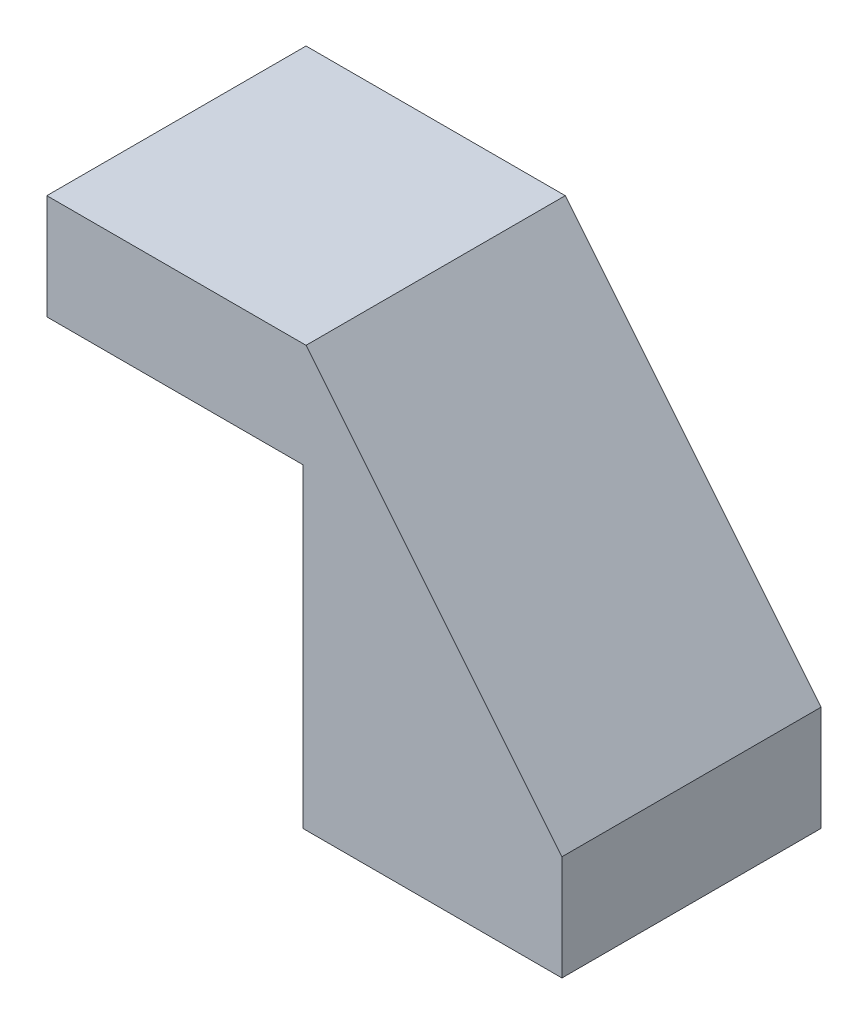
ISO-10303-21;
HEADER;
FILE_DESCRIPTION(('STEP AP214'),'2;1');
FILE_NAME('part.step','',(''),(''),'','','');
FILE_SCHEMA(('AUTOMOTIVE_DESIGN { 1 0 10303 214 1 1 1 1 }'));
ENDSEC;
DATA;
#1=APPLICATION_CONTEXT('core data for automotive mechanical design processes');
#2=APPLICATION_PROTOCOL_DEFINITION('international standard','automotive_design',2000,#1);
#3=PRODUCT_CONTEXT('',#1,'mechanical');
#4=PRODUCT('Part','Part','',(#3));
#5=PRODUCT_RELATED_PRODUCT_CATEGORY('part','',(#4));
#6=PRODUCT_DEFINITION_FORMATION('','',#4);
#7=PRODUCT_DEFINITION_CONTEXT('part definition',#1,'design');
#8=PRODUCT_DEFINITION('design','',#6,#7);
#9=PRODUCT_DEFINITION_SHAPE('','',#8);
#10=(LENGTH_UNIT() NAMED_UNIT(*) SI_UNIT(.MILLI.,.METRE.));
#11=(NAMED_UNIT(*) PLANE_ANGLE_UNIT() SI_UNIT($,.RADIAN.));
#12=(NAMED_UNIT(*) SI_UNIT($,.STERADIAN.) SOLID_ANGLE_UNIT());
#13=UNCERTAINTY_MEASURE_WITH_UNIT(LENGTH_MEASURE(1.E-05),#10,'distance_accuracy_value','');
#14=(GEOMETRIC_REPRESENTATION_CONTEXT(3) GLOBAL_UNCERTAINTY_ASSIGNED_CONTEXT((#13)) GLOBAL_UNIT_ASSIGNED_CONTEXT((#10,
#11,#12)) REPRESENTATION_CONTEXT('',''));
#15=CARTESIAN_POINT('',(0.,0.,0.));
#16=DIRECTION('',(0.,0.,1.));
#17=DIRECTION('',(1.,0.,0.));
#18=AXIS2_PLACEMENT_3D('',#15,#16,#17);
#19=CARTESIAN_POINT('',(0.,3.2,0.));
#20=DIRECTION('',(1.,0.,0.));
#21=DIRECTION('',(0.,0.,-1.));
#22=AXIS2_PLACEMENT_3D('',#19,#20,#21);
#23=PLANE('',#22);
#24=DIRECTION('',(0.,0.,1.));
#25=VECTOR('',#24,1.);
#26=CARTESIAN_POINT('',(0.,0.,0.));
#27=LINE('',#26,#25);
#28=CARTESIAN_POINT('',(0.,0.,-7.9));
#29=VERTEX_POINT('',#28);
#30=CARTESIAN_POINT('',(0.,0.,0.));
#31=VERTEX_POINT('',#30);
#32=EDGE_CURVE('E118',#29,#31,#27,.T.);
#33=ORIENTED_EDGE('',*,*,#32,.T.);
#34=DIRECTION('',(0.,-1.,0.));
#35=VECTOR('',#34,1.);
#36=CARTESIAN_POINT('',(0.,3.2,0.));
#37=LINE('',#36,#35);
#38=CARTESIAN_POINT('',(0.,9.6,0.));
#39=VERTEX_POINT('',#38);
#40=EDGE_CURVE('E11',#39,#31,#37,.T.);
#41=ORIENTED_EDGE('',*,*,#40,.F.);
#42=DIRECTION('',(0.,0.,-1.));
#43=VECTOR('',#42,1.);
#44=CARTESIAN_POINT('',(0.,9.6,-7.9));
#45=LINE('',#44,#43);
#46=CARTESIAN_POINT('',(0.,9.6,-7.9));
#47=VERTEX_POINT('',#46);
#48=EDGE_CURVE('E116',#39,#47,#45,.T.);
#49=ORIENTED_EDGE('',*,*,#48,.T.);
#50=DIRECTION('',(0.,-1.,0.));
#51=VECTOR('',#50,1.);
#52=CARTESIAN_POINT('',(0.,3.2,-7.9));
#53=LINE('',#52,#51);
#54=EDGE_CURVE('E110',#47,#29,#53,.T.);
#55=ORIENTED_EDGE('',*,*,#54,.T.);
#56=EDGE_LOOP('',(#33,#41,#49,#55));
#57=FACE_BOUND('',#56,.T.);
#58=ADVANCED_FACE('F33',(#57),#23,.F.);
#59=CARTESIAN_POINT('',(0.,3.2,0.));
#60=DIRECTION('',(0.,0.,-1.));
#61=DIRECTION('',(-1.,0.,0.));
#62=AXIS2_PLACEMENT_3D('',#59,#60,#61);
#63=PLANE('',#62);
#64=DIRECTION('',(0.,-1.,0.));
#65=VECTOR('',#64,1.);
#66=CARTESIAN_POINT('',(7.9,3.2,0.));
#67=LINE('',#66,#65);
#68=CARTESIAN_POINT('',(7.9,3.2,0.));
#69=VERTEX_POINT('',#68);
#70=CARTESIAN_POINT('',(7.9,0.,0.));
#71=VERTEX_POINT('',#70);
#72=EDGE_CURVE('E40',#69,#71,#67,.T.);
#73=ORIENTED_EDGE('',*,*,#72,.F.);
#74=DIRECTION('',(-0.630592625094466,0.776114000116266,0.));
#75=VECTOR('',#74,1.);
#76=CARTESIAN_POINT('',(0.1,12.8,0.));
#77=LINE('',#76,#75);
#78=CARTESIAN_POINT('',(0.1,12.8,0.));
#79=VERTEX_POINT('',#78);
#80=EDGE_CURVE('E94',#69,#79,#77,.T.);
#81=ORIENTED_EDGE('',*,*,#80,.T.);
#82=DIRECTION('',(1.,0.,0.));
#83=VECTOR('',#82,1.);
#84=CARTESIAN_POINT('',(0.1,12.8,0.));
#85=LINE('',#84,#83);
#86=CARTESIAN_POINT('',(-7.8,12.8,0.));
#87=VERTEX_POINT('',#86);
#88=EDGE_CURVE('E154',#87,#79,#85,.T.);
#89=ORIENTED_EDGE('',*,*,#88,.F.);
#90=DIRECTION('',(0.,-1.,0.));
#91=VECTOR('',#90,1.);
#92=CARTESIAN_POINT('',(-7.8,12.8,0.));
#93=LINE('',#92,#91);
#94=CARTESIAN_POINT('',(-7.8,9.6,0.));
#95=VERTEX_POINT('',#94);
#96=EDGE_CURVE('E145',#87,#95,#93,.T.);
#97=ORIENTED_EDGE('',*,*,#96,.T.);
#98=DIRECTION('',(1.,0.,0.));
#99=VECTOR('',#98,1.);
#100=CARTESIAN_POINT('',(0.1,9.6,0.));
#101=LINE('',#100,#99);
#102=EDGE_CURVE('E149',#95,#39,#101,.T.);
#103=ORIENTED_EDGE('',*,*,#102,.T.);
#104=ORIENTED_EDGE('',*,*,#40,.T.);
#105=DIRECTION('',(1.,0.,0.));
#106=VECTOR('',#105,1.);
#107=CARTESIAN_POINT('',(0.,0.,0.));
#108=LINE('',#107,#106);
#109=EDGE_CURVE('E107',#31,#71,#108,.T.);
#110=ORIENTED_EDGE('',*,*,#109,.T.);
#111=EDGE_LOOP('',(#73,#81,#89,#97,#103,#104,#110));
#112=FACE_BOUND('',#111,.T.);
#113=ADVANCED_FACE('F106',(#112),#63,.F.);
#114=CARTESIAN_POINT('',(7.9,3.2,0.));
#115=DIRECTION('',(-1.,0.,0.));
#116=DIRECTION('',(0.,0.,1.));
#117=AXIS2_PLACEMENT_3D('',#114,#115,#116);
#118=PLANE('',#117);
#119=DIRECTION('',(0.,0.,-1.));
#120=VECTOR('',#119,1.);
#121=CARTESIAN_POINT('',(7.9,0.,0.));
#122=LINE('',#121,#120);
#123=CARTESIAN_POINT('',(7.9,0.,-7.9));
#124=VERTEX_POINT('',#123);
#125=EDGE_CURVE('E55',#71,#124,#122,.T.);
#126=ORIENTED_EDGE('',*,*,#125,.T.);
#127=DIRECTION('',(0.,-1.,0.));
#128=VECTOR('',#127,1.);
#129=CARTESIAN_POINT('',(7.9,3.2,-7.9));
#130=LINE('',#129,#128);
#131=CARTESIAN_POINT('',(7.9,3.2,-7.9));
#132=VERTEX_POINT('',#131);
#133=EDGE_CURVE('E108',#132,#124,#130,.T.);
#134=ORIENTED_EDGE('',*,*,#133,.F.);
#135=DIRECTION('',(0.,0.,-1.));
#136=VECTOR('',#135,1.);
#137=CARTESIAN_POINT('',(7.9,3.2,0.));
#138=LINE('',#137,#136);
#139=EDGE_CURVE('E98',#69,#132,#138,.T.);
#140=ORIENTED_EDGE('',*,*,#139,.F.);
#141=ORIENTED_EDGE('',*,*,#72,.T.);
#142=EDGE_LOOP('',(#126,#134,#140,#141));
#143=FACE_BOUND('',#142,.T.);
#144=ADVANCED_FACE('F109',(#143),#118,.F.);
#145=CARTESIAN_POINT('',(0.,3.2,-7.9));
#146=DIRECTION('',(0.,0.,1.));
#147=DIRECTION('',(1.,0.,0.));
#148=AXIS2_PLACEMENT_3D('',#145,#146,#147);
#149=PLANE('',#148);
#150=DIRECTION('',(-1.,0.,0.));
#151=VECTOR('',#150,1.);
#152=CARTESIAN_POINT('',(0.,0.,-7.9));
#153=LINE('',#152,#151);
#154=EDGE_CURVE('E47',#124,#29,#153,.T.);
#155=ORIENTED_EDGE('',*,*,#154,.T.);
#156=ORIENTED_EDGE('',*,*,#54,.F.);
#157=DIRECTION('',(-1.,0.,0.));
#158=VECTOR('',#157,1.);
#159=CARTESIAN_POINT('',(0.1,9.6,-7.9));
#160=LINE('',#159,#158);
#161=CARTESIAN_POINT('',(-7.8,9.6,-7.9));
#162=VERTEX_POINT('',#161);
#163=EDGE_CURVE('E132',#47,#162,#160,.T.);
#164=ORIENTED_EDGE('',*,*,#163,.T.);
#165=DIRECTION('',(0.,-1.,0.));
#166=VECTOR('',#165,1.);
#167=CARTESIAN_POINT('',(-7.8,12.8,-7.9));
#168=LINE('',#167,#166);
#169=CARTESIAN_POINT('',(-7.8,12.8,-7.9));
#170=VERTEX_POINT('',#169);
#171=EDGE_CURVE('E134',#170,#162,#168,.T.);
#172=ORIENTED_EDGE('',*,*,#171,.F.);
#173=DIRECTION('',(-1.,0.,0.));
#174=VECTOR('',#173,1.);
#175=CARTESIAN_POINT('',(0.1,12.8,-7.9));
#176=LINE('',#175,#174);
#177=CARTESIAN_POINT('',(0.1,12.8,-7.9));
#178=VERTEX_POINT('',#177);
#179=EDGE_CURVE('E156',#178,#170,#176,.T.);
#180=ORIENTED_EDGE('',*,*,#179,.F.);
#181=DIRECTION('',(0.630592625094466,-0.776114000116266,0.));
#182=VECTOR('',#181,1.);
#183=CARTESIAN_POINT('',(0.1,12.8,-7.9));
#184=LINE('',#183,#182);
#185=EDGE_CURVE('E104',#178,#132,#184,.T.);
#186=ORIENTED_EDGE('',*,*,#185,.T.);
#187=ORIENTED_EDGE('',*,*,#133,.T.);
#188=EDGE_LOOP('',(#155,#156,#164,#172,#180,#186,#187));
#189=FACE_BOUND('',#188,.T.);
#190=ADVANCED_FACE('F123',(#189),#149,.F.);
#191=CARTESIAN_POINT('',(0.,0.,0.));
#192=DIRECTION('',(0.,-1.,0.));
#193=DIRECTION('',(0.,0.,-1.));
#194=AXIS2_PLACEMENT_3D('',#191,#192,#193);
#195=PLANE('',#194);
#196=ORIENTED_EDGE('',*,*,#125,.F.);
#197=ORIENTED_EDGE('',*,*,#109,.F.);
#198=ORIENTED_EDGE('',*,*,#32,.F.);
#199=ORIENTED_EDGE('',*,*,#154,.F.);
#200=EDGE_LOOP('',(#196,#197,#198,#199));
#201=FACE_BOUND('',#200,.T.);
#202=ADVANCED_FACE('F127',(#201),#195,.T.);
#203=CARTESIAN_POINT('',(-7.8,12.8,0.));
#204=DIRECTION('',(1.,0.,0.));
#205=DIRECTION('',(0.,0.,-1.));
#206=AXIS2_PLACEMENT_3D('',#203,#204,#205);
#207=PLANE('',#206);
#208=DIRECTION('',(0.,0.,1.));
#209=VECTOR('',#208,1.);
#210=CARTESIAN_POINT('',(-7.8,9.6,0.));
#211=LINE('',#210,#209);
#212=EDGE_CURVE('E138',#162,#95,#211,.T.);
#213=ORIENTED_EDGE('',*,*,#212,.T.);
#214=ORIENTED_EDGE('',*,*,#96,.F.);
#215=DIRECTION('',(0.,0.,1.));
#216=VECTOR('',#215,1.);
#217=CARTESIAN_POINT('',(-7.8,12.8,0.));
#218=LINE('',#217,#216);
#219=EDGE_CURVE('E144',#170,#87,#218,.T.);
#220=ORIENTED_EDGE('',*,*,#219,.F.);
#221=ORIENTED_EDGE('',*,*,#171,.T.);
#222=EDGE_LOOP('',(#213,#214,#220,#221));
#223=FACE_BOUND('',#222,.T.);
#224=ADVANCED_FACE('F141',(#223),#207,.F.);
#225=CARTESIAN_POINT('',(0.,12.8,0.));
#226=DIRECTION('',(0.,1.,0.));
#227=DIRECTION('',(0.,0.,1.));
#228=AXIS2_PLACEMENT_3D('',#225,#226,#227);
#229=PLANE('',#228);
#230=DIRECTION('',(0.,0.,-1.));
#231=VECTOR('',#230,1.);
#232=CARTESIAN_POINT('',(0.1,12.8,0.));
#233=LINE('',#232,#231);
#234=EDGE_CURVE('E100',#79,#178,#233,.T.);
#235=ORIENTED_EDGE('',*,*,#234,.T.);
#236=ORIENTED_EDGE('',*,*,#179,.T.);
#237=ORIENTED_EDGE('',*,*,#219,.T.);
#238=ORIENTED_EDGE('',*,*,#88,.T.);
#239=EDGE_LOOP('',(#235,#236,#237,#238));
#240=FACE_BOUND('',#239,.T.);
#241=ADVANCED_FACE('F161',(#240),#229,.T.);
#242=CARTESIAN_POINT('',(0.,9.6,0.));
#243=DIRECTION('',(0.,1.,0.));
#244=DIRECTION('',(0.,0.,1.));
#245=AXIS2_PLACEMENT_3D('',#242,#243,#244);
#246=PLANE('',#245);
#247=ORIENTED_EDGE('',*,*,#48,.F.);
#248=ORIENTED_EDGE('',*,*,#102,.F.);
#249=ORIENTED_EDGE('',*,*,#212,.F.);
#250=ORIENTED_EDGE('',*,*,#163,.F.);
#251=EDGE_LOOP('',(#247,#248,#249,#250));
#252=FACE_BOUND('',#251,.T.);
#253=ADVANCED_FACE('F147',(#252),#246,.F.);
#254=CARTESIAN_POINT('',(0.1,12.8,-20.269316876853));
#255=DIRECTION('',(0.776114000116265,0.630592625094466,0.));
#256=DIRECTION('',(-0.630592625094466,0.776114000116266,0.));
#257=AXIS2_PLACEMENT_3D('',#254,#255,#256);
#258=PLANE('',#257);
#259=ORIENTED_EDGE('',*,*,#185,.F.);
#260=ORIENTED_EDGE('',*,*,#234,.F.);
#261=ORIENTED_EDGE('',*,*,#80,.F.);
#262=ORIENTED_EDGE('',*,*,#139,.T.);
#263=EDGE_LOOP('',(#259,#260,#261,#262));
#264=FACE_BOUND('',#263,.T.);
#265=ADVANCED_FACE('F96',(#264),#258,.T.);
#266=CLOSED_SHELL('',(#58,#113,#144,#190,#202,#224,#241,#253,#265));
#267=MANIFOLD_SOLID_BREP('B2',#266);
#268=ADVANCED_BREP_SHAPE_REPRESENTATION('',(#18,#267),#14);
#269=SHAPE_DEFINITION_REPRESENTATION(#9,#268);
ENDSEC;
END-ISO-10303-21;
